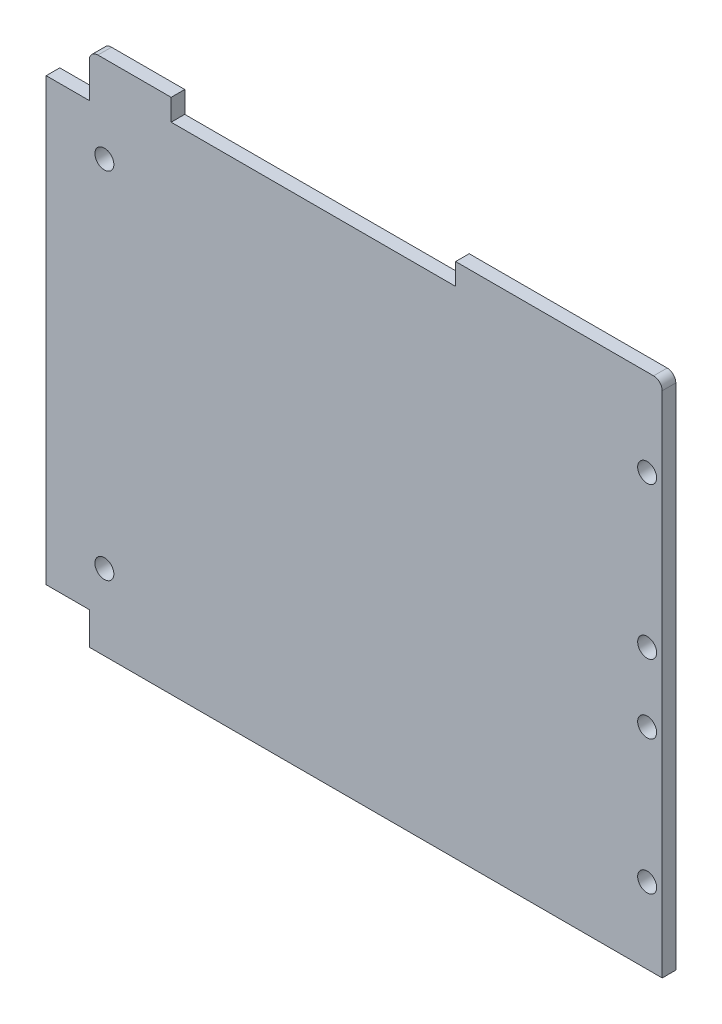
ISO-10303-21;
HEADER;
FILE_DESCRIPTION(('STEP AP214'),'2;1');
FILE_NAME('part.step','',(''),(''),'','','');
FILE_SCHEMA(('AUTOMOTIVE_DESIGN { 1 0 10303 214 1 1 1 1 }'));
ENDSEC;
DATA;
#1=APPLICATION_CONTEXT('core data for automotive mechanical design processes');
#2=APPLICATION_PROTOCOL_DEFINITION('international standard','automotive_design',2000,#1);
#3=PRODUCT_CONTEXT('',#1,'mechanical');
#4=PRODUCT('Part','Part','',(#3));
#5=PRODUCT_RELATED_PRODUCT_CATEGORY('part','',(#4));
#6=PRODUCT_DEFINITION_FORMATION('','',#4);
#7=PRODUCT_DEFINITION_CONTEXT('part definition',#1,'design');
#8=PRODUCT_DEFINITION('design','',#6,#7);
#9=PRODUCT_DEFINITION_SHAPE('','',#8);
#10=(LENGTH_UNIT() NAMED_UNIT(*) SI_UNIT(.MILLI.,.METRE.));
#11=(NAMED_UNIT(*) PLANE_ANGLE_UNIT() SI_UNIT($,.RADIAN.));
#12=(NAMED_UNIT(*) SI_UNIT($,.STERADIAN.) SOLID_ANGLE_UNIT());
#13=UNCERTAINTY_MEASURE_WITH_UNIT(LENGTH_MEASURE(1.E-05),#10,'distance_accuracy_value','');
#14=(GEOMETRIC_REPRESENTATION_CONTEXT(3) GLOBAL_UNCERTAINTY_ASSIGNED_CONTEXT((#13)) GLOBAL_UNIT_ASSIGNED_CONTEXT((#10,
#11,#12)) REPRESENTATION_CONTEXT('',''));
#15=CARTESIAN_POINT('',(0.,0.,0.));
#16=DIRECTION('',(0.,0.,1.));
#17=DIRECTION('',(1.,0.,0.));
#18=AXIS2_PLACEMENT_3D('',#15,#16,#17);
#19=CARTESIAN_POINT('',(50.0729843246072,67.1204329614403,-1.5748));
#20=DIRECTION('',(0.,1.,0.));
#21=DIRECTION('',(0.,0.,1.));
#22=AXIS2_PLACEMENT_3D('',#19,#20,#21);
#23=PLANE('',#22);
#24=DIRECTION('',(0.,0.,1.));
#25=VECTOR('',#24,1.);
#26=CARTESIAN_POINT('',(58.5729843246072,67.1204329614429,-1.575));
#27=LINE('',#26,#25);
#28=CARTESIAN_POINT('',(58.5729843246072,67.1204329614429,-1.5748));
#29=VERTEX_POINT('',#28);
#30=CARTESIAN_POINT('',(58.5729843246072,67.1204329614429,0.));
#31=VERTEX_POINT('',#30);
#32=EDGE_CURVE('E184',#29,#31,#27,.T.);
#33=ORIENTED_EDGE('',*,*,#32,.F.);
#34=DIRECTION('',(-1.,0.,0.));
#35=VECTOR('',#34,1.);
#36=CARTESIAN_POINT('',(50.0729843246072,67.1204329614403,-1.5748));
#37=LINE('',#36,#35);
#38=CARTESIAN_POINT('',(50.0729843246072,67.1204329614403,-1.5748));
#39=VERTEX_POINT('',#38);
#40=EDGE_CURVE('E292',#29,#39,#37,.T.);
#41=ORIENTED_EDGE('',*,*,#40,.T.);
#42=DIRECTION('',(0.,0.,1.));
#43=VECTOR('',#42,1.);
#44=CARTESIAN_POINT('',(50.0729843246072,67.1204329614403,-1.5748));
#45=LINE('',#44,#43);
#46=CARTESIAN_POINT('',(50.0729843246072,67.1204329614403,0.));
#47=VERTEX_POINT('',#46);
#48=EDGE_CURVE('E46',#39,#47,#45,.T.);
#49=ORIENTED_EDGE('',*,*,#48,.T.);
#50=DIRECTION('',(-1.,0.,0.));
#51=VECTOR('',#50,1.);
#52=CARTESIAN_POINT('',(50.0729843246072,67.1204329614403,0.));
#53=LINE('',#52,#51);
#54=EDGE_CURVE('E304',#31,#47,#53,.T.);
#55=ORIENTED_EDGE('',*,*,#54,.F.);
#56=EDGE_LOOP('',(#33,#41,#49,#55));
#57=FACE_BOUND('',#56,.T.);
#58=ADVANCED_FACE('F37',(#57),#23,.T.);
#59=CARTESIAN_POINT('',(49.0729843246072,66.1204329614403,-1.5748));
#60=DIRECTION('',(-1.,0.,0.));
#61=DIRECTION('',(0.,-1.,0.));
#62=AXIS2_PLACEMENT_3D('',#59,#60,#61);
#63=PLANE('',#62);
#64=DIRECTION('',(0.,0.,1.));
#65=VECTOR('',#64,1.);
#66=CARTESIAN_POINT('',(49.0729843245987,10.8954329614369,-1.575));
#67=LINE('',#66,#65);
#68=CARTESIAN_POINT('',(49.0729843245987,10.8954329614369,-1.575));
#69=VERTEX_POINT('',#68);
#70=CARTESIAN_POINT('',(49.0729843246072,10.8954329614369,0.));
#71=VERTEX_POINT('',#70);
#72=EDGE_CURVE('E214',#69,#71,#67,.T.);
#73=ORIENTED_EDGE('',*,*,#72,.F.);
#74=DIRECTION('',(0.,-1.,0.));
#75=VECTOR('',#74,1.);
#76=CARTESIAN_POINT('',(49.0729843246072,6.62043296144033,-1.575));
#77=LINE('',#76,#75);
#78=CARTESIAN_POINT('',(49.0729843246072,7.12043296144033,-1.575));
#79=VERTEX_POINT('',#78);
#80=EDGE_CURVE('E271',#69,#79,#77,.T.);
#81=ORIENTED_EDGE('',*,*,#80,.T.);
#82=DIRECTION('',(0.,0.,1.));
#83=VECTOR('',#82,1.);
#84=CARTESIAN_POINT('',(49.0729843246072,7.12043296144033,-1.575));
#85=LINE('',#84,#83);
#86=CARTESIAN_POINT('',(49.0729843246072,7.12043296144033,0.));
#87=VERTEX_POINT('',#86);
#88=EDGE_CURVE('E268',#79,#87,#85,.T.);
#89=ORIENTED_EDGE('',*,*,#88,.T.);
#90=DIRECTION('',(0.,-1.,0.));
#91=VECTOR('',#90,1.);
#92=CARTESIAN_POINT('',(49.0729843246072,66.1204329614403,0.));
#93=LINE('',#92,#91);
#94=EDGE_CURVE('E309',#71,#87,#93,.T.);
#95=ORIENTED_EDGE('',*,*,#94,.F.);
#96=EDGE_LOOP('',(#73,#81,#89,#95));
#97=FACE_BOUND('',#96,.T.);
#98=ADVANCED_FACE('F330',(#97),#63,.T.);
#99=DIRECTION('',(0.,0.,1.));
#100=VECTOR('',#99,1.);
#101=CARTESIAN_POINT('',(49.0729843245987,62.0454329614404,-1.575));
#102=LINE('',#101,#100);
#103=CARTESIAN_POINT('',(49.0729843246072,62.0454329614404,-1.5748));
#104=VERTEX_POINT('',#103);
#105=CARTESIAN_POINT('',(49.0729843246072,62.0454329614404,0.));
#106=VERTEX_POINT('',#105);
#107=EDGE_CURVE('E206',#104,#106,#102,.T.);
#108=ORIENTED_EDGE('',*,*,#107,.T.);
#109=CARTESIAN_POINT('',(49.0729843246072,66.1204329614403,0.));
#110=VERTEX_POINT('',#109);
#111=EDGE_CURVE('E289',#110,#106,#93,.T.);
#112=ORIENTED_EDGE('',*,*,#111,.F.);
#113=DIRECTION('',(0.,0.,1.));
#114=VECTOR('',#113,1.);
#115=CARTESIAN_POINT('',(49.0729843246072,66.1204329614403,-1.5748));
#116=LINE('',#115,#114);
#117=CARTESIAN_POINT('',(49.0729843246072,66.1204329614403,-1.5748));
#118=VERTEX_POINT('',#117);
#119=EDGE_CURVE('E11',#118,#110,#116,.T.);
#120=ORIENTED_EDGE('',*,*,#119,.F.);
#121=DIRECTION('',(0.,-1.,0.));
#122=VECTOR('',#121,1.);
#123=CARTESIAN_POINT('',(49.0729843246072,66.1204329614403,-1.5748));
#124=LINE('',#123,#122);
#125=EDGE_CURVE('E299',#118,#104,#124,.T.);
#126=ORIENTED_EDGE('',*,*,#125,.T.);
#127=EDGE_LOOP('',(#108,#112,#120,#126));
#128=FACE_BOUND('',#127,.T.);
#129=ADVANCED_FACE('F352',(#128),#63,.T.);
#130=CARTESIAN_POINT('',(50.0729843246072,66.1204329614403,-1.5748));
#131=DIRECTION('',(0.,0.,1.));
#132=DIRECTION('',(1.,0.,0.));
#133=AXIS2_PLACEMENT_3D('',#130,#131,#132);
#134=CYLINDRICAL_SURFACE('',#133,0.999999999999994);
#135=CARTESIAN_POINT('',(50.0729843246072,66.1204329614403,0.));
#136=DIRECTION('',(0.,0.,1.));
#137=DIRECTION('',(1.,0.,0.));
#138=AXIS2_PLACEMENT_3D('',#135,#136,#137);
#139=CIRCLE('',#138,0.999999999999994);
#140=EDGE_CURVE('E306',#47,#110,#139,.T.);
#141=ORIENTED_EDGE('',*,*,#140,.F.);
#142=ORIENTED_EDGE('',*,*,#48,.F.);
#143=CARTESIAN_POINT('',(50.0729843246072,66.1204329614403,-1.5748));
#144=DIRECTION('',(0.,0.,1.));
#145=DIRECTION('',(1.,0.,0.));
#146=AXIS2_PLACEMENT_3D('',#143,#144,#145);
#147=CIRCLE('',#146,0.999999999999994);
#148=EDGE_CURVE('E296',#39,#118,#147,.T.);
#149=ORIENTED_EDGE('',*,*,#148,.T.);
#150=ORIENTED_EDGE('',*,*,#119,.T.);
#151=EDGE_LOOP('',(#141,#142,#149,#150));
#152=FACE_BOUND('',#151,.T.);
#153=ADVANCED_FACE('F357',(#152),#134,.T.);
#154=DIRECTION('',(0.,0.,1.));
#155=VECTOR('',#154,1.);
#156=CARTESIAN_POINT('',(91.5729843246072,67.1204329614429,-1.575));
#157=LINE('',#156,#155);
#158=CARTESIAN_POINT('',(91.5729843246072,67.1204329614429,-1.5748));
#159=VERTEX_POINT('',#158);
#160=CARTESIAN_POINT('',(91.5729843246072,67.1204329614429,0.));
#161=VERTEX_POINT('',#160);
#162=EDGE_CURVE('E166',#159,#161,#157,.T.);
#163=ORIENTED_EDGE('',*,*,#162,.T.);
#164=CARTESIAN_POINT('',(114.542984324607,67.1204329614403,0.));
#165=VERTEX_POINT('',#164);
#166=EDGE_CURVE('E179',#165,#161,#53,.T.);
#167=ORIENTED_EDGE('',*,*,#166,.F.);
#168=DIRECTION('',(0.,0.,1.));
#169=VECTOR('',#168,1.);
#170=CARTESIAN_POINT('',(114.542984324607,67.1204329614403,-1.5748));
#171=LINE('',#170,#169);
#172=CARTESIAN_POINT('',(114.542984324607,67.1204329614403,-1.5748));
#173=VERTEX_POINT('',#172);
#174=EDGE_CURVE('E313',#173,#165,#171,.T.);
#175=ORIENTED_EDGE('',*,*,#174,.F.);
#176=EDGE_CURVE('E293',#173,#159,#37,.T.);
#177=ORIENTED_EDGE('',*,*,#176,.T.);
#178=EDGE_LOOP('',(#163,#167,#175,#177));
#179=FACE_BOUND('',#178,.T.);
#180=ADVANCED_FACE('F393',(#179),#23,.T.);
#181=CARTESIAN_POINT('',(114.542984324607,66.1204329614403,-1.5748));
#182=DIRECTION('',(0.,0.,1.));
#183=DIRECTION('',(1.,0.,0.));
#184=AXIS2_PLACEMENT_3D('',#181,#182,#183);
#185=CYLINDRICAL_SURFACE('',#184,1.);
#186=CARTESIAN_POINT('',(114.542984324607,66.1204329614403,0.));
#187=DIRECTION('',(0.,0.,1.));
#188=DIRECTION('',(-1.,0.,0.));
#189=AXIS2_PLACEMENT_3D('',#186,#187,#188);
#190=CIRCLE('',#189,1.);
#191=CARTESIAN_POINT('',(115.542984324607,66.1204329614403,0.));
#192=VERTEX_POINT('',#191);
#193=EDGE_CURVE('E302',#192,#165,#190,.T.);
#194=ORIENTED_EDGE('',*,*,#193,.F.);
#195=DIRECTION('',(0.,0.,1.));
#196=VECTOR('',#195,1.);
#197=CARTESIAN_POINT('',(115.542984324607,66.1204329614403,-1.5748));
#198=LINE('',#197,#196);
#199=CARTESIAN_POINT('',(115.542984324607,66.1204329614403,-1.5748));
#200=VERTEX_POINT('',#199);
#201=EDGE_CURVE('E41',#200,#192,#198,.T.);
#202=ORIENTED_EDGE('',*,*,#201,.F.);
#203=CARTESIAN_POINT('',(114.542984324607,66.1204329614403,-1.5748));
#204=DIRECTION('',(0.,0.,1.));
#205=DIRECTION('',(-1.,0.,0.));
#206=AXIS2_PLACEMENT_3D('',#203,#204,#205);
#207=CIRCLE('',#206,1.);
#208=EDGE_CURVE('E288',#200,#173,#207,.T.);
#209=ORIENTED_EDGE('',*,*,#208,.T.);
#210=ORIENTED_EDGE('',*,*,#174,.T.);
#211=EDGE_LOOP('',(#194,#202,#209,#210));
#212=FACE_BOUND('',#211,.T.);
#213=ADVANCED_FACE('F323',(#212),#185,.T.);
#214=CARTESIAN_POINT('',(115.542984324607,66.1204329614403,-1.5748));
#215=DIRECTION('',(1.,0.,0.));
#216=DIRECTION('',(0.,1.,0.));
#217=AXIS2_PLACEMENT_3D('',#214,#215,#216);
#218=PLANE('',#217);
#219=DIRECTION('',(0.,0.,1.));
#220=VECTOR('',#219,1.);
#221=CARTESIAN_POINT('',(115.542984324607,7.12043296144033,-1.575));
#222=LINE('',#221,#220);
#223=CARTESIAN_POINT('',(115.542984324607,7.12043296144033,-1.575));
#224=VERTEX_POINT('',#223);
#225=CARTESIAN_POINT('',(115.542984324607,7.12043296144033,0.));
#226=VERTEX_POINT('',#225);
#227=EDGE_CURVE('E265',#224,#226,#222,.T.);
#228=ORIENTED_EDGE('',*,*,#227,.F.);
#229=DIRECTION('',(0.,1.,0.));
#230=VECTOR('',#229,1.);
#231=CARTESIAN_POINT('',(115.542984324607,6.62043296144033,-1.575));
#232=LINE('',#231,#230);
#233=CARTESIAN_POINT('',(115.542984324607,11.9563849575794,-1.575));
#234=VERTEX_POINT('',#233);
#235=EDGE_CURVE('E274',#224,#234,#232,.T.);
#236=ORIENTED_EDGE('',*,*,#235,.T.);
#237=DIRECTION('',(0.,0.,1.));
#238=VECTOR('',#237,1.);
#239=CARTESIAN_POINT('',(115.542984324607,11.9563849575794,-1.575));
#240=LINE('',#239,#238);
#241=CARTESIAN_POINT('',(115.542984324607,11.9563849575794,-1.5748));
#242=VERTEX_POINT('',#241);
#243=EDGE_CURVE('E278',#234,#242,#240,.T.);
#244=ORIENTED_EDGE('',*,*,#243,.T.);
#245=DIRECTION('',(0.,1.,0.));
#246=VECTOR('',#245,1.);
#247=CARTESIAN_POINT('',(115.542984324607,66.1204329614403,-1.5748));
#248=LINE('',#247,#246);
#249=EDGE_CURVE('E286',#242,#200,#248,.T.);
#250=ORIENTED_EDGE('',*,*,#249,.T.);
#251=ORIENTED_EDGE('',*,*,#201,.T.);
#252=DIRECTION('',(0.,1.,0.));
#253=VECTOR('',#252,1.);
#254=CARTESIAN_POINT('',(115.542984324607,66.1204329614403,0.));
#255=LINE('',#254,#253);
#256=EDGE_CURVE('E285',#226,#192,#255,.T.);
#257=ORIENTED_EDGE('',*,*,#256,.F.);
#258=EDGE_LOOP('',(#228,#236,#244,#250,#251,#257));
#259=FACE_BOUND('',#258,.T.);
#260=ADVANCED_FACE('F39',(#259),#218,.T.);
#261=CARTESIAN_POINT('',(114.542984324607,7.62043296144033,-1.5748));
#262=DIRECTION('',(0.,0.,1.));
#263=DIRECTION('',(1.,0.,0.));
#264=AXIS2_PLACEMENT_3D('',#261,#262,#263);
#265=PLANE('',#264);
#266=ORIENTED_EDGE('',*,*,#40,.F.);
#267=DIRECTION('',(0.,-1.,0.));
#268=VECTOR('',#267,1.);
#269=CARTESIAN_POINT('',(58.5729843246072,7.62043296144033,-1.5748));
#270=LINE('',#269,#268);
#271=CARTESIAN_POINT('',(58.5729843246072,64.6204329614403,-1.5748));
#272=VERTEX_POINT('',#271);
#273=EDGE_CURVE('E190',#29,#272,#270,.T.);
#274=ORIENTED_EDGE('',*,*,#273,.T.);
#275=DIRECTION('',(1.,0.,0.));
#276=VECTOR('',#275,1.);
#277=CARTESIAN_POINT('',(114.542984324607,64.6204329614403,-1.5748));
#278=LINE('',#277,#276);
#279=CARTESIAN_POINT('',(91.5729843246072,64.6204329614403,-1.5748));
#280=VERTEX_POINT('',#279);
#281=EDGE_CURVE('E186',#272,#280,#278,.T.);
#282=ORIENTED_EDGE('',*,*,#281,.T.);
#283=DIRECTION('',(0.,1.,0.));
#284=VECTOR('',#283,1.);
#285=CARTESIAN_POINT('',(91.5729843246072,7.62043296144033,-1.5748));
#286=LINE('',#285,#284);
#287=EDGE_CURVE('E163',#280,#159,#286,.T.);
#288=ORIENTED_EDGE('',*,*,#287,.T.);
#289=ORIENTED_EDGE('',*,*,#176,.F.);
#290=ORIENTED_EDGE('',*,*,#208,.F.);
#291=ORIENTED_EDGE('',*,*,#249,.F.);
#292=DIRECTION('',(-1.,0.,0.));
#293=VECTOR('',#292,1.);
#294=CARTESIAN_POINT('',(114.542984324607,11.9563849575794,-1.5748));
#295=LINE('',#294,#293);
#296=CARTESIAN_POINT('',(49.0729843246072,11.9563849575794,-1.5748));
#297=VERTEX_POINT('',#296);
#298=EDGE_CURVE('E281',#242,#297,#295,.T.);
#299=ORIENTED_EDGE('',*,*,#298,.T.);
#300=DIRECTION('',(0.,1.,0.));
#301=VECTOR('',#300,1.);
#302=CARTESIAN_POINT('',(49.0729843245987,7.62043296144033,-1.5748));
#303=LINE('',#302,#301);
#304=EDGE_CURVE('E62',#297,#104,#303,.T.);
#305=ORIENTED_EDGE('',*,*,#304,.T.);
#306=ORIENTED_EDGE('',*,*,#125,.F.);
#307=ORIENTED_EDGE('',*,*,#148,.F.);
#308=EDGE_LOOP('',(#266,#274,#282,#288,#289,#290,#291,#299,#305,#306,#307));
#309=FACE_BOUND('',#308,.T.);
#310=CARTESIAN_POINT('',(50.8229843246072,15.8954329614404,-1.5748));
#311=DIRECTION('',(0.,0.,1.));
#312=DIRECTION('',(1.,0.,0.));
#313=AXIS2_PLACEMENT_3D('',#310,#311,#312);
#314=CIRCLE('',#313,1.09999999999999);
#315=CARTESIAN_POINT('',(51.9229843246072,15.8954329614404,-1.5748));
#316=VERTEX_POINT('',#315);
#317=EDGE_CURVE('E228',#316,#316,#314,.T.);
#318=ORIENTED_EDGE('',*,*,#317,.T.);
#319=EDGE_LOOP('',(#318));
#320=FACE_BOUND('',#319,.T.);
#321=CARTESIAN_POINT('',(50.8229843246072,57.0454329614403,-1.5748));
#322=DIRECTION('',(0.,0.,1.));
#323=DIRECTION('',(1.,0.,0.));
#324=AXIS2_PLACEMENT_3D('',#321,#322,#323);
#325=CIRCLE('',#324,1.09999999999999);
#326=CARTESIAN_POINT('',(51.9229843246072,57.0454329614403,-1.5748));
#327=VERTEX_POINT('',#326);
#328=EDGE_CURVE('E234',#327,#327,#325,.T.);
#329=ORIENTED_EDGE('',*,*,#328,.T.);
#330=EDGE_LOOP('',(#329));
#331=FACE_BOUND('',#330,.T.);
#332=CARTESIAN_POINT('',(113.792984324607,57.0454329614403,-1.5748));
#333=DIRECTION('',(0.,0.,1.));
#334=DIRECTION('',(1.,0.,0.));
#335=AXIS2_PLACEMENT_3D('',#332,#333,#334);
#336=CIRCLE('',#335,1.09999999999999);
#337=CARTESIAN_POINT('',(114.892984324607,57.0454329614403,-1.5748));
#338=VERTEX_POINT('',#337);
#339=EDGE_CURVE('E240',#338,#338,#336,.T.);
#340=ORIENTED_EDGE('',*,*,#339,.T.);
#341=EDGE_LOOP('',(#340));
#342=FACE_BOUND('',#341,.T.);
#343=CARTESIAN_POINT('',(113.792984324607,39.4704329614403,-1.5748));
#344=DIRECTION('',(0.,0.,1.));
#345=DIRECTION('',(1.,0.,0.));
#346=AXIS2_PLACEMENT_3D('',#343,#344,#345);
#347=CIRCLE('',#346,1.09999999999999);
#348=CARTESIAN_POINT('',(114.892984324607,39.4704329614403,-1.5748));
#349=VERTEX_POINT('',#348);
#350=EDGE_CURVE('E246',#349,#349,#347,.T.);
#351=ORIENTED_EDGE('',*,*,#350,.T.);
#352=EDGE_LOOP('',(#351));
#353=FACE_BOUND('',#352,.T.);
#354=CARTESIAN_POINT('',(113.792984324607,15.8954329614404,-1.5748));
#355=DIRECTION('',(0.,0.,1.));
#356=DIRECTION('',(1.,0.,0.));
#357=AXIS2_PLACEMENT_3D('',#354,#355,#356);
#358=CIRCLE('',#357,1.09999999999999);
#359=CARTESIAN_POINT('',(114.892984324607,15.8954329614404,-1.5748));
#360=VERTEX_POINT('',#359);
#361=EDGE_CURVE('E252',#360,#360,#358,.T.);
#362=ORIENTED_EDGE('',*,*,#361,.T.);
#363=EDGE_LOOP('',(#362));
#364=FACE_BOUND('',#363,.T.);
#365=CARTESIAN_POINT('',(113.792984324607,31.4704329614403,-1.5748));
#366=DIRECTION('',(0.,0.,1.));
#367=DIRECTION('',(1.,0.,0.));
#368=AXIS2_PLACEMENT_3D('',#365,#366,#367);
#369=CIRCLE('',#368,1.09999999999999);
#370=CARTESIAN_POINT('',(114.892984324607,31.4704329614403,-1.5748));
#371=VERTEX_POINT('',#370);
#372=EDGE_CURVE('E258',#371,#371,#369,.T.);
#373=ORIENTED_EDGE('',*,*,#372,.T.);
#374=EDGE_LOOP('',(#373));
#375=FACE_BOUND('',#374,.T.);
#376=ADVANCED_FACE('F360',(#309,#320,#331,#342,#353,#364,#375),#265,.F.);
#377=CARTESIAN_POINT('',(114.542984324607,7.62043296144033,0.));
#378=DIRECTION('',(0.,0.,1.));
#379=DIRECTION('',(1.,0.,0.));
#380=AXIS2_PLACEMENT_3D('',#377,#378,#379);
#381=PLANE('',#380);
#382=DIRECTION('',(0.,-1.,0.));
#383=VECTOR('',#382,1.);
#384=CARTESIAN_POINT('',(58.5729843246072,64.6204329614403,0.));
#385=LINE('',#384,#383);
#386=CARTESIAN_POINT('',(58.5729843246072,64.6204329614403,0.));
#387=VERTEX_POINT('',#386);
#388=EDGE_CURVE('E54',#31,#387,#385,.T.);
#389=ORIENTED_EDGE('',*,*,#388,.F.);
#390=ORIENTED_EDGE('',*,*,#54,.T.);
#391=ORIENTED_EDGE('',*,*,#140,.T.);
#392=ORIENTED_EDGE('',*,*,#111,.T.);
#393=DIRECTION('',(-1.,0.,0.));
#394=VECTOR('',#393,1.);
#395=CARTESIAN_POINT('',(49.0729843245987,62.0454329614404,0.));
#396=LINE('',#395,#394);
#397=CARTESIAN_POINT('',(44.0729843246038,62.0454329614404,0.));
#398=VERTEX_POINT('',#397);
#399=EDGE_CURVE('E193',#106,#398,#396,.T.);
#400=ORIENTED_EDGE('',*,*,#399,.T.);
#401=DIRECTION('',(0.,-1.,0.));
#402=VECTOR('',#401,1.);
#403=CARTESIAN_POINT('',(44.0729843246038,62.0454329614404,0.));
#404=LINE('',#403,#402);
#405=CARTESIAN_POINT('',(44.0729843246038,10.8954329614369,0.));
#406=VERTEX_POINT('',#405);
#407=EDGE_CURVE('E209',#398,#406,#404,.T.);
#408=ORIENTED_EDGE('',*,*,#407,.T.);
#409=DIRECTION('',(1.,0.,0.));
#410=VECTOR('',#409,1.);
#411=CARTESIAN_POINT('',(49.0729843245987,10.8954329614369,0.));
#412=LINE('',#411,#410);
#413=EDGE_CURVE('E197',#406,#71,#412,.T.);
#414=ORIENTED_EDGE('',*,*,#413,.T.);
#415=ORIENTED_EDGE('',*,*,#94,.T.);
#416=DIRECTION('',(-1.,0.,0.));
#417=VECTOR('',#416,1.);
#418=CARTESIAN_POINT('',(49.0729843246072,7.12043296144033,0.));
#419=LINE('',#418,#417);
#420=EDGE_CURVE('E261',#226,#87,#419,.T.);
#421=ORIENTED_EDGE('',*,*,#420,.F.);
#422=ORIENTED_EDGE('',*,*,#256,.T.);
#423=ORIENTED_EDGE('',*,*,#193,.T.);
#424=ORIENTED_EDGE('',*,*,#166,.T.);
#425=DIRECTION('',(0.,1.,0.));
#426=VECTOR('',#425,1.);
#427=CARTESIAN_POINT('',(91.5729843246072,64.6204329614403,0.));
#428=LINE('',#427,#426);
#429=CARTESIAN_POINT('',(91.5729843246072,64.6204329614403,0.));
#430=VERTEX_POINT('',#429);
#431=EDGE_CURVE('E160',#430,#161,#428,.T.);
#432=ORIENTED_EDGE('',*,*,#431,.F.);
#433=DIRECTION('',(1.,0.,0.));
#434=VECTOR('',#433,1.);
#435=CARTESIAN_POINT('',(58.5729843246072,64.6204329614403,0.));
#436=LINE('',#435,#434);
#437=EDGE_CURVE('E170',#387,#430,#436,.T.);
#438=ORIENTED_EDGE('',*,*,#437,.F.);
#439=EDGE_LOOP('',(#389,#390,#391,#392,#400,#408,#414,#415,#421,#422,#423,#424,#432,#438));
#440=FACE_BOUND('',#439,.T.);
#441=CARTESIAN_POINT('',(50.8229843246072,15.8954329614404,0.));
#442=DIRECTION('',(0.,0.,-1.));
#443=DIRECTION('',(0.,1.,0.));
#444=AXIS2_PLACEMENT_3D('',#441,#442,#443);
#445=CIRCLE('',#444,1.09999999999999);
#446=CARTESIAN_POINT('',(50.8229843246072,16.9954329614404,0.));
#447=VERTEX_POINT('',#446);
#448=EDGE_CURVE('E225',#447,#447,#445,.T.);
#449=ORIENTED_EDGE('',*,*,#448,.T.);
#450=EDGE_LOOP('',(#449));
#451=FACE_BOUND('',#450,.T.);
#452=CARTESIAN_POINT('',(50.8229843246072,57.0454329614403,0.));
#453=DIRECTION('',(0.,0.,-1.));
#454=DIRECTION('',(0.,1.,0.));
#455=AXIS2_PLACEMENT_3D('',#452,#453,#454);
#456=CIRCLE('',#455,1.09999999999999);
#457=CARTESIAN_POINT('',(50.8229843246072,58.1454329614403,0.));
#458=VERTEX_POINT('',#457);
#459=EDGE_CURVE('E231',#458,#458,#456,.T.);
#460=ORIENTED_EDGE('',*,*,#459,.T.);
#461=EDGE_LOOP('',(#460));
#462=FACE_BOUND('',#461,.T.);
#463=CARTESIAN_POINT('',(113.792984324607,57.0454329614403,0.));
#464=DIRECTION('',(0.,0.,-1.));
#465=DIRECTION('',(0.,1.,0.));
#466=AXIS2_PLACEMENT_3D('',#463,#464,#465);
#467=CIRCLE('',#466,1.09999999999999);
#468=CARTESIAN_POINT('',(113.792984324607,58.1454329614403,0.));
#469=VERTEX_POINT('',#468);
#470=EDGE_CURVE('E237',#469,#469,#467,.T.);
#471=ORIENTED_EDGE('',*,*,#470,.T.);
#472=EDGE_LOOP('',(#471));
#473=FACE_BOUND('',#472,.T.);
#474=CARTESIAN_POINT('',(113.792984324607,39.4704329614403,0.));
#475=DIRECTION('',(0.,0.,-1.));
#476=DIRECTION('',(0.,1.,0.));
#477=AXIS2_PLACEMENT_3D('',#474,#475,#476);
#478=CIRCLE('',#477,1.09999999999999);
#479=CARTESIAN_POINT('',(113.792984324607,40.5704329614403,0.));
#480=VERTEX_POINT('',#479);
#481=EDGE_CURVE('E243',#480,#480,#478,.T.);
#482=ORIENTED_EDGE('',*,*,#481,.T.);
#483=EDGE_LOOP('',(#482));
#484=FACE_BOUND('',#483,.T.);
#485=CARTESIAN_POINT('',(113.792984324607,15.8954329614404,0.));
#486=DIRECTION('',(0.,0.,-1.));
#487=DIRECTION('',(0.,1.,0.));
#488=AXIS2_PLACEMENT_3D('',#485,#486,#487);
#489=CIRCLE('',#488,1.09999999999999);
#490=CARTESIAN_POINT('',(113.792984324607,16.9954329614404,0.));
#491=VERTEX_POINT('',#490);
#492=EDGE_CURVE('E249',#491,#491,#489,.T.);
#493=ORIENTED_EDGE('',*,*,#492,.T.);
#494=EDGE_LOOP('',(#493));
#495=FACE_BOUND('',#494,.T.);
#496=CARTESIAN_POINT('',(113.792984324607,31.4704329614403,0.));
#497=DIRECTION('',(0.,0.,-1.));
#498=DIRECTION('',(0.,1.,0.));
#499=AXIS2_PLACEMENT_3D('',#496,#497,#498);
#500=CIRCLE('',#499,1.09999999999999);
#501=CARTESIAN_POINT('',(113.792984324607,32.5704329614403,0.));
#502=VERTEX_POINT('',#501);
#503=EDGE_CURVE('E255',#502,#502,#500,.T.);
#504=ORIENTED_EDGE('',*,*,#503,.T.);
#505=EDGE_LOOP('',(#504));
#506=FACE_BOUND('',#505,.T.);
#507=ADVANCED_FACE('F175',(#440,#451,#462,#473,#484,#495,#506),#381,.T.);
#508=CARTESIAN_POINT('',(49.0729843246072,11.9563849575794,-1.575));
#509=DIRECTION('',(0.,1.,0.));
#510=DIRECTION('',(0.,0.,1.));
#511=AXIS2_PLACEMENT_3D('',#508,#509,#510);
#512=PLANE('',#511);
#513=ORIENTED_EDGE('',*,*,#298,.F.);
#514=ORIENTED_EDGE('',*,*,#243,.F.);
#515=DIRECTION('',(-1.,0.,0.));
#516=VECTOR('',#515,1.);
#517=CARTESIAN_POINT('',(49.0729843246072,11.9563849575794,-1.575));
#518=LINE('',#517,#516);
#519=CARTESIAN_POINT('',(49.0729843246072,11.9563849575794,-1.575));
#520=VERTEX_POINT('',#519);
#521=EDGE_CURVE('E276',#234,#520,#518,.T.);
#522=ORIENTED_EDGE('',*,*,#521,.T.);
#523=DIRECTION('',(0.,0.,1.));
#524=VECTOR('',#523,1.);
#525=CARTESIAN_POINT('',(49.0729843246072,11.9563849575794,-1.575));
#526=LINE('',#525,#524);
#527=EDGE_CURVE('E279',#520,#297,#526,.T.);
#528=ORIENTED_EDGE('',*,*,#527,.T.);
#529=EDGE_LOOP('',(#513,#514,#522,#528));
#530=FACE_BOUND('',#529,.T.);
#531=ADVANCED_FACE('F339',(#530),#512,.T.);
#532=CARTESIAN_POINT('',(0.,0.,-1.575));
#533=DIRECTION('',(0.,0.,-1.));
#534=DIRECTION('',(-1.,0.,0.));
#535=AXIS2_PLACEMENT_3D('',#532,#533,#534);
#536=PLANE('',#535);
#537=DIRECTION('',(-1.,0.,0.));
#538=VECTOR('',#537,1.);
#539=CARTESIAN_POINT('',(49.0729843246072,7.12043296144033,-1.575));
#540=LINE('',#539,#538);
#541=EDGE_CURVE('E262',#224,#79,#540,.T.);
#542=ORIENTED_EDGE('',*,*,#541,.T.);
#543=ORIENTED_EDGE('',*,*,#80,.F.);
#544=DIRECTION('',(1.,0.,0.));
#545=VECTOR('',#544,1.);
#546=CARTESIAN_POINT('',(49.0729843245987,10.8954329614369,-1.575));
#547=LINE('',#546,#545);
#548=CARTESIAN_POINT('',(44.0729843246038,10.8954329614369,-1.575));
#549=VERTEX_POINT('',#548);
#550=EDGE_CURVE('E203',#549,#69,#547,.T.);
#551=ORIENTED_EDGE('',*,*,#550,.F.);
#552=DIRECTION('',(0.,-1.,0.));
#553=VECTOR('',#552,1.);
#554=CARTESIAN_POINT('',(44.0729843246038,62.0454329614404,-1.575));
#555=LINE('',#554,#553);
#556=CARTESIAN_POINT('',(44.0729843246038,62.0454329614404,-1.575));
#557=VERTEX_POINT('',#556);
#558=EDGE_CURVE('E200',#557,#549,#555,.T.);
#559=ORIENTED_EDGE('',*,*,#558,.F.);
#560=DIRECTION('',(-1.,0.,0.));
#561=VECTOR('',#560,1.);
#562=CARTESIAN_POINT('',(49.0729843245987,62.0454329614404,-1.575));
#563=LINE('',#562,#561);
#564=CARTESIAN_POINT('',(49.0729843245987,62.0454329614404,-1.575));
#565=VERTEX_POINT('',#564);
#566=EDGE_CURVE('E196',#565,#557,#563,.T.);
#567=ORIENTED_EDGE('',*,*,#566,.F.);
#568=DIRECTION('',(0.,1.,0.));
#569=VECTOR('',#568,1.);
#570=CARTESIAN_POINT('',(49.0729843245987,62.0454329614404,-1.575));
#571=LINE('',#570,#569);
#572=EDGE_CURVE('E194',#520,#565,#571,.T.);
#573=ORIENTED_EDGE('',*,*,#572,.F.);
#574=ORIENTED_EDGE('',*,*,#521,.F.);
#575=ORIENTED_EDGE('',*,*,#235,.F.);
#576=EDGE_LOOP('',(#542,#543,#551,#559,#567,#573,#574,#575));
#577=FACE_BOUND('',#576,.T.);
#578=ADVANCED_FACE('F333',(#577),#536,.T.);
#579=CARTESIAN_POINT('',(49.0729843246072,7.12043296144033,-1.575));
#580=DIRECTION('',(0.,1.,0.));
#581=DIRECTION('',(0.,0.,1.));
#582=AXIS2_PLACEMENT_3D('',#579,#580,#581);
#583=PLANE('',#582);
#584=ORIENTED_EDGE('',*,*,#420,.T.);
#585=ORIENTED_EDGE('',*,*,#88,.F.);
#586=ORIENTED_EDGE('',*,*,#541,.F.);
#587=ORIENTED_EDGE('',*,*,#227,.T.);
#588=EDGE_LOOP('',(#584,#585,#586,#587));
#589=FACE_BOUND('',#588,.T.);
#590=ADVANCED_FACE('F327',(#589),#583,.F.);
#591=CARTESIAN_POINT('',(113.792984324607,31.4704329614403,-6.57479999999998));
#592=DIRECTION('',(0.,0.,-1.));
#593=DIRECTION('',(0.,1.,0.));
#594=AXIS2_PLACEMENT_3D('',#591,#592,#593);
#595=CYLINDRICAL_SURFACE('',#594,1.09999999999999);
#596=ORIENTED_EDGE('',*,*,#503,.F.);
#597=EDGE_LOOP('',(#596));
#598=FACE_BOUND('',#597,.T.);
#599=ORIENTED_EDGE('',*,*,#372,.F.);
#600=EDGE_LOOP('',(#599));
#601=FACE_BOUND('',#600,.T.);
#602=ADVANCED_FACE('F376',(#598,#601),#595,.F.);
#603=CARTESIAN_POINT('',(113.792984324607,15.8954329614404,-6.57479999999998));
#604=DIRECTION('',(0.,0.,-1.));
#605=DIRECTION('',(0.,1.,0.));
#606=AXIS2_PLACEMENT_3D('',#603,#604,#605);
#607=CYLINDRICAL_SURFACE('',#606,1.09999999999999);
#608=ORIENTED_EDGE('',*,*,#492,.F.);
#609=EDGE_LOOP('',(#608));
#610=FACE_BOUND('',#609,.T.);
#611=ORIENTED_EDGE('',*,*,#361,.F.);
#612=EDGE_LOOP('',(#611));
#613=FACE_BOUND('',#612,.T.);
#614=ADVANCED_FACE('F378',(#610,#613),#607,.F.);
#615=CARTESIAN_POINT('',(113.792984324607,39.4704329614403,-6.57479999999998));
#616=DIRECTION('',(0.,0.,-1.));
#617=DIRECTION('',(0.,1.,0.));
#618=AXIS2_PLACEMENT_3D('',#615,#616,#617);
#619=CYLINDRICAL_SURFACE('',#618,1.09999999999999);
#620=ORIENTED_EDGE('',*,*,#481,.F.);
#621=EDGE_LOOP('',(#620));
#622=FACE_BOUND('',#621,.T.);
#623=ORIENTED_EDGE('',*,*,#350,.F.);
#624=EDGE_LOOP('',(#623));
#625=FACE_BOUND('',#624,.T.);
#626=ADVANCED_FACE('F385',(#622,#625),#619,.F.);
#627=CARTESIAN_POINT('',(113.792984324607,57.0454329614403,-6.57479999999998));
#628=DIRECTION('',(0.,0.,-1.));
#629=DIRECTION('',(0.,1.,0.));
#630=AXIS2_PLACEMENT_3D('',#627,#628,#629);
#631=CYLINDRICAL_SURFACE('',#630,1.09999999999999);
#632=ORIENTED_EDGE('',*,*,#470,.F.);
#633=EDGE_LOOP('',(#632));
#634=FACE_BOUND('',#633,.T.);
#635=ORIENTED_EDGE('',*,*,#339,.F.);
#636=EDGE_LOOP('',(#635));
#637=FACE_BOUND('',#636,.T.);
#638=ADVANCED_FACE('F435',(#634,#637),#631,.F.);
#639=CARTESIAN_POINT('',(50.8229843246072,57.0454329614403,-6.57479999999997));
#640=DIRECTION('',(0.,0.,-1.));
#641=DIRECTION('',(0.,1.,0.));
#642=AXIS2_PLACEMENT_3D('',#639,#640,#641);
#643=CYLINDRICAL_SURFACE('',#642,1.09999999999999);
#644=ORIENTED_EDGE('',*,*,#459,.F.);
#645=EDGE_LOOP('',(#644));
#646=FACE_BOUND('',#645,.T.);
#647=ORIENTED_EDGE('',*,*,#328,.F.);
#648=EDGE_LOOP('',(#647));
#649=FACE_BOUND('',#648,.T.);
#650=ADVANCED_FACE('F431',(#646,#649),#643,.F.);
#651=CARTESIAN_POINT('',(50.8229843246072,15.8954329614404,-6.57479999999997));
#652=DIRECTION('',(0.,0.,-1.));
#653=DIRECTION('',(0.,1.,0.));
#654=AXIS2_PLACEMENT_3D('',#651,#652,#653);
#655=CYLINDRICAL_SURFACE('',#654,1.09999999999999);
#656=ORIENTED_EDGE('',*,*,#448,.F.);
#657=EDGE_LOOP('',(#656));
#658=FACE_BOUND('',#657,.T.);
#659=ORIENTED_EDGE('',*,*,#317,.F.);
#660=EDGE_LOOP('',(#659));
#661=FACE_BOUND('',#660,.T.);
#662=ADVANCED_FACE('F428',(#658,#661),#655,.F.);
#663=CARTESIAN_POINT('',(49.0729843245987,62.0454329614404,-1.575));
#664=DIRECTION('',(1.,0.,0.));
#665=DIRECTION('',(0.,0.,-1.));
#666=AXIS2_PLACEMENT_3D('',#663,#664,#665);
#667=PLANE('',#666);
#668=ORIENTED_EDGE('',*,*,#304,.F.);
#669=ORIENTED_EDGE('',*,*,#527,.F.);
#670=ORIENTED_EDGE('',*,*,#572,.T.);
#671=EDGE_CURVE('E221',#565,#104,#102,.T.);
#672=ORIENTED_EDGE('',*,*,#671,.T.);
#673=EDGE_LOOP('',(#668,#669,#670,#672));
#674=FACE_BOUND('',#673,.T.);
#675=ADVANCED_FACE('F345',(#674),#667,.T.);
#676=CARTESIAN_POINT('',(49.0729843245987,10.8954329614369,-1.575));
#677=DIRECTION('',(0.,-1.,0.));
#678=DIRECTION('',(0.,0.,-1.));
#679=AXIS2_PLACEMENT_3D('',#676,#677,#678);
#680=PLANE('',#679);
#681=ORIENTED_EDGE('',*,*,#413,.F.);
#682=DIRECTION('',(0.,0.,1.));
#683=VECTOR('',#682,1.);
#684=CARTESIAN_POINT('',(44.0729843246038,10.8954329614369,-1.575));
#685=LINE('',#684,#683);
#686=EDGE_CURVE('E217',#549,#406,#685,.T.);
#687=ORIENTED_EDGE('',*,*,#686,.F.);
#688=ORIENTED_EDGE('',*,*,#550,.T.);
#689=ORIENTED_EDGE('',*,*,#72,.T.);
#690=EDGE_LOOP('',(#681,#687,#688,#689));
#691=FACE_BOUND('',#690,.T.);
#692=ADVANCED_FACE('F419',(#691),#680,.T.);
#693=CARTESIAN_POINT('',(44.0729843246038,62.0454329614404,-1.575));
#694=DIRECTION('',(-1.,0.,0.));
#695=DIRECTION('',(0.,0.,1.));
#696=AXIS2_PLACEMENT_3D('',#693,#694,#695);
#697=PLANE('',#696);
#698=ORIENTED_EDGE('',*,*,#407,.F.);
#699=DIRECTION('',(0.,0.,1.));
#700=VECTOR('',#699,1.);
#701=CARTESIAN_POINT('',(44.0729843246038,62.0454329614404,-1.575));
#702=LINE('',#701,#700);
#703=EDGE_CURVE('E219',#557,#398,#702,.T.);
#704=ORIENTED_EDGE('',*,*,#703,.F.);
#705=ORIENTED_EDGE('',*,*,#558,.T.);
#706=ORIENTED_EDGE('',*,*,#686,.T.);
#707=EDGE_LOOP('',(#698,#704,#705,#706));
#708=FACE_BOUND('',#707,.T.);
#709=ADVANCED_FACE('F415',(#708),#697,.T.);
#710=CARTESIAN_POINT('',(49.0729843245987,62.0454329614404,-1.575));
#711=DIRECTION('',(0.,1.,0.));
#712=DIRECTION('',(0.,0.,1.));
#713=AXIS2_PLACEMENT_3D('',#710,#711,#712);
#714=PLANE('',#713);
#715=ORIENTED_EDGE('',*,*,#399,.F.);
#716=ORIENTED_EDGE('',*,*,#107,.F.);
#717=ORIENTED_EDGE('',*,*,#671,.F.);
#718=ORIENTED_EDGE('',*,*,#566,.T.);
#719=ORIENTED_EDGE('',*,*,#703,.T.);
#720=EDGE_LOOP('',(#715,#716,#717,#718,#719));
#721=FACE_BOUND('',#720,.T.);
#722=ADVANCED_FACE('F349',(#721),#714,.T.);
#723=CARTESIAN_POINT('',(58.5729843246072,64.6204329614403,-1.575));
#724=DIRECTION('',(-1.,0.,0.));
#725=DIRECTION('',(0.,0.,1.));
#726=AXIS2_PLACEMENT_3D('',#723,#724,#725);
#727=PLANE('',#726);
#728=ORIENTED_EDGE('',*,*,#32,.T.);
#729=ORIENTED_EDGE('',*,*,#388,.T.);
#730=DIRECTION('',(0.,0.,1.));
#731=VECTOR('',#730,1.);
#732=CARTESIAN_POINT('',(58.5729843246072,64.6204329614403,-1.575));
#733=LINE('',#732,#731);
#734=EDGE_CURVE('E167',#272,#387,#733,.T.);
#735=ORIENTED_EDGE('',*,*,#734,.F.);
#736=ORIENTED_EDGE('',*,*,#273,.F.);
#737=EDGE_LOOP('',(#728,#729,#735,#736));
#738=FACE_BOUND('',#737,.T.);
#739=ADVANCED_FACE('F407',(#738),#727,.F.);
#740=CARTESIAN_POINT('',(91.5729843246072,64.6204329614403,-1.575));
#741=DIRECTION('',(1.,0.,0.));
#742=DIRECTION('',(0.,0.,-1.));
#743=AXIS2_PLACEMENT_3D('',#740,#741,#742);
#744=PLANE('',#743);
#745=DIRECTION('',(0.,0.,1.));
#746=VECTOR('',#745,1.);
#747=CARTESIAN_POINT('',(91.5729843246072,64.6204329614403,-1.575));
#748=LINE('',#747,#746);
#749=EDGE_CURVE('E156',#280,#430,#748,.T.);
#750=ORIENTED_EDGE('',*,*,#749,.T.);
#751=ORIENTED_EDGE('',*,*,#431,.T.);
#752=ORIENTED_EDGE('',*,*,#162,.F.);
#753=ORIENTED_EDGE('',*,*,#287,.F.);
#754=EDGE_LOOP('',(#750,#751,#752,#753));
#755=FACE_BOUND('',#754,.T.);
#756=ADVANCED_FACE('F158',(#755),#744,.F.);
#757=CARTESIAN_POINT('',(58.5729843246072,64.6204329614403,-1.575));
#758=DIRECTION('',(0.,-1.,0.));
#759=DIRECTION('',(0.,0.,-1.));
#760=AXIS2_PLACEMENT_3D('',#757,#758,#759);
#761=PLANE('',#760);
#762=ORIENTED_EDGE('',*,*,#734,.T.);
#763=ORIENTED_EDGE('',*,*,#437,.T.);
#764=ORIENTED_EDGE('',*,*,#749,.F.);
#765=ORIENTED_EDGE('',*,*,#281,.F.);
#766=EDGE_LOOP('',(#762,#763,#764,#765));
#767=FACE_BOUND('',#766,.T.);
#768=ADVANCED_FACE('F171',(#767),#761,.F.);
#769=CLOSED_SHELL('',(#58,#98,#129,#153,#180,#213,#260,#376,#507,#531,#578,#590,#602,#614,#626,
#638,#650,#662,#675,#692,#709,#722,#739,#756,#768));
#770=MANIFOLD_SOLID_BREP('B2',#769);
#771=ADVANCED_BREP_SHAPE_REPRESENTATION('',(#18,#770),#14);
#772=SHAPE_DEFINITION_REPRESENTATION(#9,#771);
ENDSEC;
END-ISO-10303-21;
